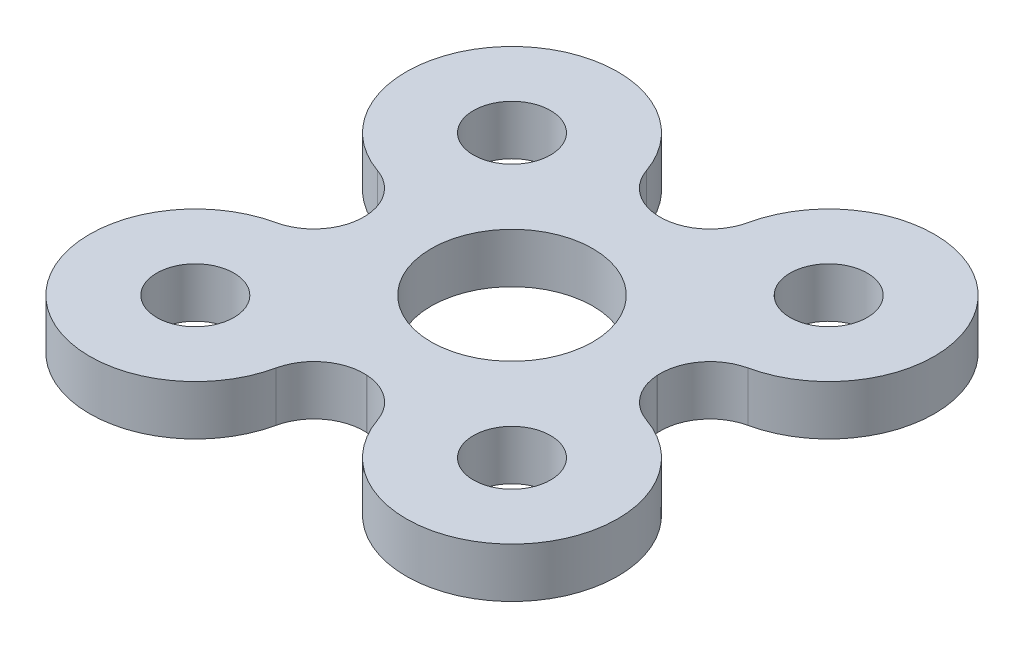
ISO-10303-21;
HEADER;
FILE_DESCRIPTION(('STEP AP214'),'2;1');
FILE_NAME('part.step','',(''),(''),'','','');
FILE_SCHEMA(('AUTOMOTIVE_DESIGN { 1 0 10303 214 1 1 1 1 }'));
ENDSEC;
DATA;
#1=APPLICATION_CONTEXT('core data for automotive mechanical design processes');
#2=APPLICATION_PROTOCOL_DEFINITION('international standard','automotive_design',2000,#1);
#3=PRODUCT_CONTEXT('',#1,'mechanical');
#4=PRODUCT('Part','Part','',(#3));
#5=PRODUCT_RELATED_PRODUCT_CATEGORY('part','',(#4));
#6=PRODUCT_DEFINITION_FORMATION('','',#4);
#7=PRODUCT_DEFINITION_CONTEXT('part definition',#1,'design');
#8=PRODUCT_DEFINITION('design','',#6,#7);
#9=PRODUCT_DEFINITION_SHAPE('','',#8);
#10=(LENGTH_UNIT() NAMED_UNIT(*) SI_UNIT(.MILLI.,.METRE.));
#11=(NAMED_UNIT(*) PLANE_ANGLE_UNIT() SI_UNIT($,.RADIAN.));
#12=(NAMED_UNIT(*) SI_UNIT($,.STERADIAN.) SOLID_ANGLE_UNIT());
#13=UNCERTAINTY_MEASURE_WITH_UNIT(LENGTH_MEASURE(1.E-05),#10,'distance_accuracy_value','');
#14=(GEOMETRIC_REPRESENTATION_CONTEXT(3) GLOBAL_UNCERTAINTY_ASSIGNED_CONTEXT((#13)) GLOBAL_UNIT_ASSIGNED_CONTEXT((#10,
#11,#12)) REPRESENTATION_CONTEXT('',''));
#15=CARTESIAN_POINT('',(0.,0.,0.));
#16=DIRECTION('',(0.,0.,1.));
#17=DIRECTION('',(1.,0.,0.));
#18=AXIS2_PLACEMENT_3D('',#15,#16,#17);
#19=CARTESIAN_POINT('',(-0.339490821660947,-2.,9.19373406087037));
#20=DIRECTION('',(0.,1.,0.));
#21=DIRECTION('',(0.,0.,1.));
#22=AXIS2_PLACEMENT_3D('',#19,#20,#21);
#23=CYLINDRICAL_SURFACE('',#22,3.5);
#24=CARTESIAN_POINT('',(-0.339490821660947,-2.,9.19373406087037));
#25=DIRECTION('',(0.,1.,0.));
#26=DIRECTION('',(0.,0.,1.));
#27=AXIS2_PLACEMENT_3D('',#24,#25,#26);
#28=CIRCLE('',#27,3.5);
#29=CARTESIAN_POINT('',(-0.133058471389949,-2.,5.69982712382102));
#30=VERTEX_POINT('',#29);
#31=CARTESIAN_POINT('',(-0.148470708568788,-2.,5.69895061745156));
#32=VERTEX_POINT('',#31);
#33=EDGE_CURVE('E323',#30,#32,#28,.T.);
#34=ORIENTED_EDGE('',*,*,#33,.F.);
#35=DIRECTION('',(0.,1.,0.));
#36=VECTOR('',#35,1.);
#37=CARTESIAN_POINT('',(-0.133058471389949,-2.,5.69982712382102));
#38=LINE('',#37,#36);
#39=CARTESIAN_POINT('',(-0.133058471389949,0.,5.69982712382102));
#40=VERTEX_POINT('',#39);
#41=EDGE_CURVE('E219',#30,#40,#38,.T.);
#42=ORIENTED_EDGE('',*,*,#41,.T.);
#43=CARTESIAN_POINT('',(-0.339490821660947,0.,9.19373406087037));
#44=DIRECTION('',(0.,1.,0.));
#45=DIRECTION('',(0.,0.,1.));
#46=AXIS2_PLACEMENT_3D('',#43,#44,#45);
#47=CIRCLE('',#46,3.5);
#48=CARTESIAN_POINT('',(-0.148470708568788,0.,5.69895061745156));
#49=VERTEX_POINT('',#48);
#50=EDGE_CURVE('E298',#40,#49,#47,.T.);
#51=ORIENTED_EDGE('',*,*,#50,.T.);
#52=DIRECTION('',(0.,1.,0.));
#53=VECTOR('',#52,1.);
#54=CARTESIAN_POINT('',(-0.148470708568788,-2.,5.69895061745156));
#55=LINE('',#54,#53);
#56=EDGE_CURVE('E217',#49,#32,#55,.F.);
#57=ORIENTED_EDGE('',*,*,#56,.T.);
#58=EDGE_LOOP('',(#34,#42,#51,#57));
#59=FACE_BOUND('',#58,.T.);
#60=ADVANCED_FACE('F47',(#59),#23,.F.);
#61=CARTESIAN_POINT('',(-6.36405673126666,-2.,6.36405673126669));
#62=DIRECTION('',(0.,1.,0.));
#63=DIRECTION('',(0.,0.,1.));
#64=AXIS2_PLACEMENT_3D('',#61,#62,#63);
#65=CYLINDRICAL_SURFACE('',#64,4.25);
#66=CARTESIAN_POINT('',(-6.36405673126666,-2.,6.36405673126669));
#67=DIRECTION('',(0.,1.,0.));
#68=DIRECTION('',(0.,0.,1.));
#69=AXIS2_PLACEMENT_3D('',#66,#67,#68);
#70=CIRCLE('',#69,4.25);
#71=CARTESIAN_POINT('',(-7.27394914846286,-2.,2.21259966306415));
#72=VERTEX_POINT('',#71);
#73=CARTESIAN_POINT('',(-2.2116831940622,-2.,7.26975756902942));
#74=VERTEX_POINT('',#73);
#75=EDGE_CURVE('E278',#72,#74,#70,.T.);
#76=ORIENTED_EDGE('',*,*,#75,.T.);
#77=DIRECTION('',(0.,1.,0.));
#78=VECTOR('',#77,1.);
#79=CARTESIAN_POINT('',(-2.2116831940622,-2.,7.26975756902942));
#80=LINE('',#79,#78);
#81=CARTESIAN_POINT('',(-2.2116831940622,0.,7.26975756902942));
#82=VERTEX_POINT('',#81);
#83=EDGE_CURVE('E224',#74,#82,#80,.T.);
#84=ORIENTED_EDGE('',*,*,#83,.T.);
#85=CARTESIAN_POINT('',(-6.36405673126666,0.,6.36405673126669));
#86=DIRECTION('',(0.,1.,0.));
#87=DIRECTION('',(0.,0.,1.));
#88=AXIS2_PLACEMENT_3D('',#85,#86,#87);
#89=CIRCLE('',#88,4.25);
#90=CARTESIAN_POINT('',(-7.27394914846286,0.,2.21259966306415));
#91=VERTEX_POINT('',#90);
#92=EDGE_CURVE('E262',#91,#82,#89,.T.);
#93=ORIENTED_EDGE('',*,*,#92,.F.);
#94=DIRECTION('',(0.,1.,0.));
#95=VECTOR('',#94,1.);
#96=CARTESIAN_POINT('',(-7.27394914846286,-2.,2.21259966306415));
#97=LINE('',#96,#95);
#98=EDGE_CURVE('E222',#91,#72,#97,.F.);
#99=ORIENTED_EDGE('',*,*,#98,.T.);
#100=EDGE_LOOP('',(#76,#84,#93,#99));
#101=FACE_BOUND('',#100,.T.);
#102=ADVANCED_FACE('F358',(#101),#65,.T.);
#103=CARTESIAN_POINT('',(-9.2,-2.,0.338953386132517));
#104=DIRECTION('',(0.,1.,0.));
#105=DIRECTION('',(0.,0.,1.));
#106=AXIS2_PLACEMENT_3D('',#103,#104,#105);
#107=CYLINDRICAL_SURFACE('',#106,3.5);
#108=CARTESIAN_POINT('',(-9.2,-2.,0.338953386132517));
#109=DIRECTION('',(0.,1.,0.));
#110=DIRECTION('',(0.,0.,1.));
#111=AXIS2_PLACEMENT_3D('',#108,#109,#110);
#112=CIRCLE('',#111,3.5);
#113=CARTESIAN_POINT('',(-5.7063245958294,-2.,0.128638930392015));
#114=VERTEX_POINT('',#113);
#115=CARTESIAN_POINT('',(-5.70497890255034,-2.,0.152332035848622));
#116=VERTEX_POINT('',#115);
#117=EDGE_CURVE('E272',#114,#116,#112,.F.);
#118=ORIENTED_EDGE('',*,*,#117,.T.);
#119=DIRECTION('',(0.,1.,0.));
#120=VECTOR('',#119,1.);
#121=CARTESIAN_POINT('',(-5.70497890255034,-2.,0.152332035848622));
#122=LINE('',#121,#120);
#123=CARTESIAN_POINT('',(-5.70497890255034,0.,0.152332035848622));
#124=VERTEX_POINT('',#123);
#125=EDGE_CURVE('E228',#116,#124,#122,.T.);
#126=ORIENTED_EDGE('',*,*,#125,.T.);
#127=CARTESIAN_POINT('',(-9.2,0.,0.338953386132517));
#128=DIRECTION('',(0.,1.,0.));
#129=DIRECTION('',(0.,0.,1.));
#130=AXIS2_PLACEMENT_3D('',#127,#128,#129);
#131=CIRCLE('',#130,3.5);
#132=CARTESIAN_POINT('',(-5.7063245958294,0.,0.128638930392015));
#133=VERTEX_POINT('',#132);
#134=EDGE_CURVE('E255',#133,#124,#131,.F.);
#135=ORIENTED_EDGE('',*,*,#134,.F.);
#136=DIRECTION('',(0.,1.,0.));
#137=VECTOR('',#136,1.);
#138=CARTESIAN_POINT('',(-5.7063245958294,-2.,0.128638930392015));
#139=LINE('',#138,#137);
#140=EDGE_CURVE('E69',#133,#114,#139,.F.);
#141=ORIENTED_EDGE('',*,*,#140,.T.);
#142=EDGE_LOOP('',(#118,#126,#135,#141));
#143=FACE_BOUND('',#142,.T.);
#144=ADVANCED_FACE('F260',(#143),#107,.F.);
#145=CARTESIAN_POINT('',(-5.65685424949237,-2.,-5.65685424949239));
#146=DIRECTION('',(0.,1.,0.));
#147=DIRECTION('',(0.,0.,1.));
#148=AXIS2_PLACEMENT_3D('',#145,#146,#147);
#149=CYLINDRICAL_SURFACE('',#148,4.25);
#150=CARTESIAN_POINT('',(-5.65685424949237,0.,-5.65685424949239));
#151=DIRECTION('',(0.,1.,0.));
#152=DIRECTION('',(0.,0.,1.));
#153=AXIS2_PLACEMENT_3D('',#150,#151,#152);
#154=CIRCLE('',#153,4.25);
#155=CARTESIAN_POINT('',(-1.63949988604424,0.,-7.04370821386075));
#156=VERTEX_POINT('',#155);
#157=CARTESIAN_POINT('',(-7.04803652776499,0.,-1.64099669865469));
#158=VERTEX_POINT('',#157);
#159=EDGE_CURVE('E257',#156,#158,#154,.T.);
#160=ORIENTED_EDGE('',*,*,#159,.F.);
#161=DIRECTION('',(0.,1.,0.));
#162=VECTOR('',#161,1.);
#163=CARTESIAN_POINT('',(-1.63949988604424,-2.,-7.04370821386075));
#164=LINE('',#163,#162);
#165=CARTESIAN_POINT('',(-1.63949988604424,-2.,-7.04370821386075));
#166=VERTEX_POINT('',#165);
#167=EDGE_CURVE('E206',#156,#166,#164,.F.);
#168=ORIENTED_EDGE('',*,*,#167,.T.);
#169=CARTESIAN_POINT('',(-5.65685424949237,-2.,-5.65685424949239));
#170=DIRECTION('',(0.,1.,0.));
#171=DIRECTION('',(0.,0.,1.));
#172=AXIS2_PLACEMENT_3D('',#169,#170,#171);
#173=CIRCLE('',#172,4.25);
#174=CARTESIAN_POINT('',(-7.04803652776499,-2.,-1.64099669865469));
#175=VERTEX_POINT('',#174);
#176=EDGE_CURVE('E270',#166,#175,#173,.T.);
#177=ORIENTED_EDGE('',*,*,#176,.T.);
#178=DIRECTION('',(0.,1.,0.));
#179=VECTOR('',#178,1.);
#180=CARTESIAN_POINT('',(-7.04803652776499,-2.,-1.64099669865468));
#181=LINE('',#180,#179);
#182=EDGE_CURVE('E203',#175,#158,#181,.T.);
#183=ORIENTED_EDGE('',*,*,#182,.T.);
#184=EDGE_LOOP('',(#160,#168,#177,#183));
#185=FACE_BOUND('',#184,.T.);
#186=ADVANCED_FACE('F274',(#185),#149,.T.);
#187=CARTESIAN_POINT('',(0.339490821660946,-2.,-9.19373406087037));
#188=DIRECTION('',(0.,1.,0.));
#189=DIRECTION('',(0.,0.,1.));
#190=AXIS2_PLACEMENT_3D('',#187,#188,#189);
#191=CYLINDRICAL_SURFACE('',#190,3.5);
#192=CARTESIAN_POINT('',(0.339490821660946,0.,-9.19373406087037));
#193=DIRECTION('',(0.,1.,0.));
#194=DIRECTION('',(0.,0.,1.));
#195=AXIS2_PLACEMENT_3D('',#192,#193,#194);
#196=CIRCLE('',#195,3.5);
#197=CARTESIAN_POINT('',(0.133058471389942,0.,-5.69982712382102));
#198=VERTEX_POINT('',#197);
#199=CARTESIAN_POINT('',(0.148470708568785,0.,-5.69895061745156));
#200=VERTEX_POINT('',#199);
#201=EDGE_CURVE('E184',#198,#200,#196,.T.);
#202=ORIENTED_EDGE('',*,*,#201,.T.);
#203=DIRECTION('',(0.,1.,0.));
#204=VECTOR('',#203,1.);
#205=CARTESIAN_POINT('',(0.148470708568785,-2.,-5.69895061745156));
#206=LINE('',#205,#204);
#207=CARTESIAN_POINT('',(0.148470708568785,-2.,-5.69895061745156));
#208=VERTEX_POINT('',#207);
#209=EDGE_CURVE('E201',#200,#208,#206,.F.);
#210=ORIENTED_EDGE('',*,*,#209,.T.);
#211=CARTESIAN_POINT('',(0.339490821660946,-2.,-9.19373406087037));
#212=DIRECTION('',(0.,1.,0.));
#213=DIRECTION('',(0.,0.,1.));
#214=AXIS2_PLACEMENT_3D('',#211,#212,#213);
#215=CIRCLE('',#214,3.5);
#216=CARTESIAN_POINT('',(0.133058471389942,-2.,-5.69982712382102));
#217=VERTEX_POINT('',#216);
#218=EDGE_CURVE('E276',#217,#208,#215,.T.);
#219=ORIENTED_EDGE('',*,*,#218,.F.);
#220=DIRECTION('',(0.,1.,0.));
#221=VECTOR('',#220,1.);
#222=CARTESIAN_POINT('',(0.133058471389942,-2.,-5.69982712382102));
#223=LINE('',#222,#221);
#224=EDGE_CURVE('E190',#217,#198,#223,.T.);
#225=ORIENTED_EDGE('',*,*,#224,.T.);
#226=EDGE_LOOP('',(#202,#210,#219,#225));
#227=FACE_BOUND('',#226,.T.);
#228=ADVANCED_FACE('F342',(#227),#191,.F.);
#229=CARTESIAN_POINT('',(6.36405673126666,-2.,-6.36405673126669));
#230=DIRECTION('',(0.,1.,0.));
#231=DIRECTION('',(0.,0.,1.));
#232=AXIS2_PLACEMENT_3D('',#229,#230,#231);
#233=CYLINDRICAL_SURFACE('',#232,4.25);
#234=CARTESIAN_POINT('',(6.36405673126666,-2.,-6.36405673126669));
#235=DIRECTION('',(0.,1.,0.));
#236=DIRECTION('',(0.,0.,1.));
#237=AXIS2_PLACEMENT_3D('',#234,#235,#236);
#238=CIRCLE('',#237,4.25);
#239=CARTESIAN_POINT('',(7.27394914846286,-2.,-2.21259966306414));
#240=VERTEX_POINT('',#239);
#241=CARTESIAN_POINT('',(2.2116831940622,-2.,-7.26975756902942));
#242=VERTEX_POINT('',#241);
#243=EDGE_CURVE('E281',#240,#242,#238,.T.);
#244=ORIENTED_EDGE('',*,*,#243,.T.);
#245=DIRECTION('',(0.,1.,0.));
#246=VECTOR('',#245,1.);
#247=CARTESIAN_POINT('',(2.2116831940622,-2.,-7.26975756902942));
#248=LINE('',#247,#246);
#249=CARTESIAN_POINT('',(2.2116831940622,0.,-7.26975756902942));
#250=VERTEX_POINT('',#249);
#251=EDGE_CURVE('E183',#242,#250,#248,.T.);
#252=ORIENTED_EDGE('',*,*,#251,.T.);
#253=CARTESIAN_POINT('',(6.36405673126666,0.,-6.36405673126669));
#254=DIRECTION('',(0.,1.,0.));
#255=DIRECTION('',(0.,0.,1.));
#256=AXIS2_PLACEMENT_3D('',#253,#254,#255);
#257=CIRCLE('',#256,4.25);
#258=CARTESIAN_POINT('',(7.27394914846286,0.,-2.21259966306414));
#259=VERTEX_POINT('',#258);
#260=EDGE_CURVE('E166',#259,#250,#257,.T.);
#261=ORIENTED_EDGE('',*,*,#260,.F.);
#262=DIRECTION('',(0.,1.,0.));
#263=VECTOR('',#262,1.);
#264=CARTESIAN_POINT('',(7.27394914846286,-2.,-2.21259966306414));
#265=LINE('',#264,#263);
#266=EDGE_CURVE('E180',#259,#240,#265,.F.);
#267=ORIENTED_EDGE('',*,*,#266,.T.);
#268=EDGE_LOOP('',(#244,#252,#261,#267));
#269=FACE_BOUND('',#268,.T.);
#270=ADVANCED_FACE('F179',(#269),#233,.T.);
#271=CARTESIAN_POINT('',(9.2,-2.,-0.338953386132518));
#272=DIRECTION('',(0.,1.,0.));
#273=DIRECTION('',(0.,0.,1.));
#274=AXIS2_PLACEMENT_3D('',#271,#272,#273);
#275=CYLINDRICAL_SURFACE('',#274,3.5);
#276=CARTESIAN_POINT('',(9.2,0.,-0.338953386132518));
#277=DIRECTION('',(0.,1.,0.));
#278=DIRECTION('',(0.,0.,1.));
#279=AXIS2_PLACEMENT_3D('',#276,#277,#278);
#280=CIRCLE('',#279,3.5);
#281=CARTESIAN_POINT('',(5.70497890255034,0.,-0.152332035848613));
#282=VERTEX_POINT('',#281);
#283=CARTESIAN_POINT('',(5.7063245958294,0.,-0.128638930392021));
#284=VERTEX_POINT('',#283);
#285=EDGE_CURVE('E168',#282,#284,#280,.T.);
#286=ORIENTED_EDGE('',*,*,#285,.T.);
#287=DIRECTION('',(0.,1.,0.));
#288=VECTOR('',#287,1.);
#289=CARTESIAN_POINT('',(5.7063245958294,-2.,-0.128638930392021));
#290=LINE('',#289,#288);
#291=CARTESIAN_POINT('',(5.7063245958294,-2.,-0.128638930392021));
#292=VERTEX_POINT('',#291);
#293=EDGE_CURVE('E215',#284,#292,#290,.F.);
#294=ORIENTED_EDGE('',*,*,#293,.T.);
#295=CARTESIAN_POINT('',(9.2,-2.,-0.338953386132518));
#296=DIRECTION('',(0.,1.,0.));
#297=DIRECTION('',(0.,0.,1.));
#298=AXIS2_PLACEMENT_3D('',#295,#296,#297);
#299=CIRCLE('',#298,3.5);
#300=CARTESIAN_POINT('',(5.70497890255034,-2.,-0.152332035848613));
#301=VERTEX_POINT('',#300);
#302=EDGE_CURVE('E332',#301,#292,#299,.T.);
#303=ORIENTED_EDGE('',*,*,#302,.F.);
#304=DIRECTION('',(0.,1.,0.));
#305=VECTOR('',#304,1.);
#306=CARTESIAN_POINT('',(5.70497890255034,-2.,-0.152332035848613));
#307=LINE('',#306,#305);
#308=EDGE_CURVE('E213',#301,#282,#307,.T.);
#309=ORIENTED_EDGE('',*,*,#308,.T.);
#310=EDGE_LOOP('',(#286,#294,#303,#309));
#311=FACE_BOUND('',#310,.T.);
#312=ADVANCED_FACE('F374',(#311),#275,.F.);
#313=CARTESIAN_POINT('',(6.36405673126666,-2.,-6.36405673126669));
#314=DIRECTION('',(0.,1.,0.));
#315=DIRECTION('',(0.,0.,1.));
#316=AXIS2_PLACEMENT_3D('',#313,#314,#315);
#317=CYLINDRICAL_SURFACE('',#316,1.55);
#318=CARTESIAN_POINT('',(6.36405673126666,-2.,-6.36405673126669));
#319=DIRECTION('',(0.,1.,0.));
#320=DIRECTION('',(0.,0.,1.));
#321=AXIS2_PLACEMENT_3D('',#318,#319,#320);
#322=CIRCLE('',#321,1.55);
#323=CARTESIAN_POINT('',(6.36405673126666,-2.,-4.81405673126669));
#324=VERTEX_POINT('',#323);
#325=EDGE_CURVE('E193',#324,#324,#322,.T.);
#326=ORIENTED_EDGE('',*,*,#325,.F.);
#327=EDGE_LOOP('',(#326));
#328=FACE_BOUND('',#327,.T.);
#329=CARTESIAN_POINT('',(6.36405673126666,0.,-6.36405673126669));
#330=DIRECTION('',(0.,1.,0.));
#331=DIRECTION('',(0.,0.,1.));
#332=AXIS2_PLACEMENT_3D('',#329,#330,#331);
#333=CIRCLE('',#332,1.55);
#334=CARTESIAN_POINT('',(6.36405673126666,0.,-4.81405673126669));
#335=VERTEX_POINT('',#334);
#336=EDGE_CURVE('E318',#335,#335,#333,.T.);
#337=ORIENTED_EDGE('',*,*,#336,.T.);
#338=EDGE_LOOP('',(#337));
#339=FACE_BOUND('',#338,.T.);
#340=ADVANCED_FACE('F377',(#328,#339),#317,.F.);
#341=CARTESIAN_POINT('',(5.65685424949237,-2.,5.65685424949239));
#342=DIRECTION('',(0.,1.,0.));
#343=DIRECTION('',(0.,0.,1.));
#344=AXIS2_PLACEMENT_3D('',#341,#342,#343);
#345=CYLINDRICAL_SURFACE('',#344,1.55);
#346=CARTESIAN_POINT('',(5.65685424949237,-2.,5.65685424949239));
#347=DIRECTION('',(0.,1.,0.));
#348=DIRECTION('',(0.,0.,1.));
#349=AXIS2_PLACEMENT_3D('',#346,#347,#348);
#350=CIRCLE('',#349,1.55);
#351=CARTESIAN_POINT('',(5.65685424949237,-2.,7.20685424949239));
#352=VERTEX_POINT('',#351);
#353=EDGE_CURVE('E293',#352,#352,#350,.T.);
#354=ORIENTED_EDGE('',*,*,#353,.F.);
#355=EDGE_LOOP('',(#354));
#356=FACE_BOUND('',#355,.T.);
#357=CARTESIAN_POINT('',(5.65685424949237,0.,5.65685424949239));
#358=DIRECTION('',(0.,1.,0.));
#359=DIRECTION('',(0.,0.,1.));
#360=AXIS2_PLACEMENT_3D('',#357,#358,#359);
#361=CIRCLE('',#360,1.55);
#362=CARTESIAN_POINT('',(5.65685424949237,0.,7.20685424949239));
#363=VERTEX_POINT('',#362);
#364=EDGE_CURVE('E316',#363,#363,#361,.T.);
#365=ORIENTED_EDGE('',*,*,#364,.T.);
#366=EDGE_LOOP('',(#365));
#367=FACE_BOUND('',#366,.T.);
#368=ADVANCED_FACE('F393',(#356,#367),#345,.F.);
#369=CARTESIAN_POINT('',(-5.65685424949237,-2.,-5.65685424949239));
#370=DIRECTION('',(0.,1.,0.));
#371=DIRECTION('',(0.,0.,1.));
#372=AXIS2_PLACEMENT_3D('',#369,#370,#371);
#373=CYLINDRICAL_SURFACE('',#372,1.55);
#374=CARTESIAN_POINT('',(-5.65685424949237,-2.,-5.65685424949239));
#375=DIRECTION('',(0.,1.,0.));
#376=DIRECTION('',(0.,0.,1.));
#377=AXIS2_PLACEMENT_3D('',#374,#375,#376);
#378=CIRCLE('',#377,1.55);
#379=CARTESIAN_POINT('',(-5.65685424949237,-2.,-4.10685424949239));
#380=VERTEX_POINT('',#379);
#381=EDGE_CURVE('E290',#380,#380,#378,.T.);
#382=ORIENTED_EDGE('',*,*,#381,.F.);
#383=EDGE_LOOP('',(#382));
#384=FACE_BOUND('',#383,.T.);
#385=CARTESIAN_POINT('',(-5.65685424949237,0.,-5.65685424949239));
#386=DIRECTION('',(0.,1.,0.));
#387=DIRECTION('',(0.,0.,1.));
#388=AXIS2_PLACEMENT_3D('',#385,#386,#387);
#389=CIRCLE('',#388,1.55);
#390=CARTESIAN_POINT('',(-5.65685424949237,0.,-4.10685424949239));
#391=VERTEX_POINT('',#390);
#392=EDGE_CURVE('E313',#391,#391,#389,.T.);
#393=ORIENTED_EDGE('',*,*,#392,.T.);
#394=EDGE_LOOP('',(#393));
#395=FACE_BOUND('',#394,.T.);
#396=ADVANCED_FACE('F389',(#384,#395),#373,.F.);
#397=CARTESIAN_POINT('',(0.,-2.,0.));
#398=DIRECTION('',(0.,1.,0.));
#399=DIRECTION('',(0.,0.,1.));
#400=AXIS2_PLACEMENT_3D('',#397,#398,#399);
#401=CYLINDRICAL_SURFACE('',#400,3.25);
#402=CARTESIAN_POINT('',(0.,-2.,0.));
#403=DIRECTION('',(0.,1.,0.));
#404=DIRECTION('',(0.,0.,1.));
#405=AXIS2_PLACEMENT_3D('',#402,#403,#404);
#406=CIRCLE('',#405,3.25);
#407=CARTESIAN_POINT('',(0.,-2.,3.25));
#408=VERTEX_POINT('',#407);
#409=EDGE_CURVE('E287',#408,#408,#406,.T.);
#410=ORIENTED_EDGE('',*,*,#409,.F.);
#411=EDGE_LOOP('',(#410));
#412=FACE_BOUND('',#411,.T.);
#413=CARTESIAN_POINT('',(0.,0.,0.));
#414=DIRECTION('',(0.,1.,0.));
#415=DIRECTION('',(0.,0.,1.));
#416=AXIS2_PLACEMENT_3D('',#413,#414,#415);
#417=CIRCLE('',#416,3.25);
#418=CARTESIAN_POINT('',(0.,0.,3.25));
#419=VERTEX_POINT('',#418);
#420=EDGE_CURVE('E310',#419,#419,#417,.T.);
#421=ORIENTED_EDGE('',*,*,#420,.T.);
#422=EDGE_LOOP('',(#421));
#423=FACE_BOUND('',#422,.T.);
#424=ADVANCED_FACE('F372',(#412,#423),#401,.F.);
#425=CARTESIAN_POINT('',(5.65685424949237,-2.,5.65685424949239));
#426=DIRECTION('',(0.,1.,0.));
#427=DIRECTION('',(0.,0.,1.));
#428=AXIS2_PLACEMENT_3D('',#425,#426,#427);
#429=CYLINDRICAL_SURFACE('',#428,4.25);
#430=CARTESIAN_POINT('',(5.65685424949237,-2.,5.65685424949239));
#431=DIRECTION('',(0.,1.,0.));
#432=DIRECTION('',(0.,0.,1.));
#433=AXIS2_PLACEMENT_3D('',#430,#431,#432);
#434=CIRCLE('',#433,4.25);
#435=CARTESIAN_POINT('',(1.63949988604423,-2.,7.04370821386075));
#436=VERTEX_POINT('',#435);
#437=CARTESIAN_POINT('',(7.04803652776498,-2.,1.64099669865468));
#438=VERTEX_POINT('',#437);
#439=EDGE_CURVE('E327',#436,#438,#434,.T.);
#440=ORIENTED_EDGE('',*,*,#439,.T.);
#441=DIRECTION('',(0.,1.,0.));
#442=VECTOR('',#441,1.);
#443=CARTESIAN_POINT('',(7.04803652776498,-2.,1.64099669865468));
#444=LINE('',#443,#442);
#445=CARTESIAN_POINT('',(7.04803652776498,0.,1.64099669865468));
#446=VERTEX_POINT('',#445);
#447=EDGE_CURVE('E210',#438,#446,#444,.T.);
#448=ORIENTED_EDGE('',*,*,#447,.T.);
#449=CARTESIAN_POINT('',(5.65685424949237,0.,5.65685424949239));
#450=DIRECTION('',(0.,1.,0.));
#451=DIRECTION('',(0.,0.,1.));
#452=AXIS2_PLACEMENT_3D('',#449,#450,#451);
#453=CIRCLE('',#452,4.25);
#454=CARTESIAN_POINT('',(1.63949988604423,0.,7.04370821386075));
#455=VERTEX_POINT('',#454);
#456=EDGE_CURVE('E301',#455,#446,#453,.T.);
#457=ORIENTED_EDGE('',*,*,#456,.F.);
#458=DIRECTION('',(0.,1.,0.));
#459=VECTOR('',#458,1.);
#460=CARTESIAN_POINT('',(1.63949988604423,-2.,7.04370821386075));
#461=LINE('',#460,#459);
#462=EDGE_CURVE('E208',#455,#436,#461,.F.);
#463=ORIENTED_EDGE('',*,*,#462,.T.);
#464=EDGE_LOOP('',(#440,#448,#457,#463));
#465=FACE_BOUND('',#464,.T.);
#466=ADVANCED_FACE('F368',(#465),#429,.T.);
#467=CARTESIAN_POINT('',(-6.36405673126666,-2.,6.36405673126669));
#468=DIRECTION('',(0.,1.,0.));
#469=DIRECTION('',(0.,0.,1.));
#470=AXIS2_PLACEMENT_3D('',#467,#468,#469);
#471=CYLINDRICAL_SURFACE('',#470,1.55);
#472=CARTESIAN_POINT('',(-6.36405673126666,-2.,6.36405673126669));
#473=DIRECTION('',(0.,1.,0.));
#474=DIRECTION('',(0.,0.,1.));
#475=AXIS2_PLACEMENT_3D('',#472,#473,#474);
#476=CIRCLE('',#475,1.55);
#477=CARTESIAN_POINT('',(-6.36405673126666,-2.,7.91405673126669));
#478=VERTEX_POINT('',#477);
#479=EDGE_CURVE('E188',#478,#478,#476,.T.);
#480=ORIENTED_EDGE('',*,*,#479,.F.);
#481=EDGE_LOOP('',(#480));
#482=FACE_BOUND('',#481,.T.);
#483=CARTESIAN_POINT('',(-6.36405673126666,0.,6.36405673126669));
#484=DIRECTION('',(0.,1.,0.));
#485=DIRECTION('',(0.,0.,1.));
#486=AXIS2_PLACEMENT_3D('',#483,#484,#485);
#487=CIRCLE('',#486,1.55);
#488=CARTESIAN_POINT('',(-6.36405673126666,0.,7.91405673126669));
#489=VERTEX_POINT('',#488);
#490=EDGE_CURVE('E196',#489,#489,#487,.T.);
#491=ORIENTED_EDGE('',*,*,#490,.T.);
#492=EDGE_LOOP('',(#491));
#493=FACE_BOUND('',#492,.T.);
#494=ADVANCED_FACE('F371',(#482,#493),#471,.F.);
#495=CARTESIAN_POINT('',(0.,-2.,0.));
#496=DIRECTION('',(0.,1.,0.));
#497=DIRECTION('',(0.,0.,1.));
#498=AXIS2_PLACEMENT_3D('',#495,#496,#497);
#499=PLANE('',#498);
#500=ORIENTED_EDGE('',*,*,#439,.F.);
#501=CARTESIAN_POINT('',(-0.251019814401948,-2.,7.6963453735635));
#502=DIRECTION('',(0.,1.,0.));
#503=DIRECTION('',(0.,0.,1.));
#504=AXIS2_PLACEMENT_3D('',#501,#502,#503);
#505=CIRCLE('',#504,2.);
#506=EDGE_CURVE('E245',#436,#30,#505,.T.);
#507=ORIENTED_EDGE('',*,*,#506,.T.);
#508=ORIENTED_EDGE('',*,*,#33,.T.);
#509=CARTESIAN_POINT('',(-0.257625058907164,-2.,7.69596972797659));
#510=DIRECTION('',(0.,1.,0.));
#511=DIRECTION('',(0.,0.,1.));
#512=AXIS2_PLACEMENT_3D('',#509,#510,#511);
#513=CIRCLE('',#512,2.);
#514=EDGE_CURVE('E249',#32,#74,#513,.T.);
#515=ORIENTED_EDGE('',*,*,#514,.T.);
#516=ORIENTED_EDGE('',*,*,#75,.F.);
#517=CARTESIAN_POINT('',(-7.70213381537872,-2.,0.258972807439419));
#518=DIRECTION('',(0.,1.,0.));
#519=DIRECTION('',(0.,0.,1.));
#520=AXIS2_PLACEMENT_3D('',#517,#518,#519);
#521=CIRCLE('',#520,2.);
#522=EDGE_CURVE('E62',#72,#116,#521,.T.);
#523=ORIENTED_EDGE('',*,*,#522,.T.);
#524=ORIENTED_EDGE('',*,*,#117,.F.);
#525=CARTESIAN_POINT('',(-7.70271054106975,-2.,0.248818619386588));
#526=DIRECTION('',(0.,1.,0.));
#527=DIRECTION('',(0.,0.,1.));
#528=AXIS2_PLACEMENT_3D('',#525,#526,#527);
#529=CIRCLE('',#528,2.);
#530=EDGE_CURVE('E11',#114,#175,#529,.T.);
#531=ORIENTED_EDGE('',*,*,#530,.T.);
#532=ORIENTED_EDGE('',*,*,#176,.F.);
#533=CARTESIAN_POINT('',(0.251019814401944,-2.,-7.69634537356351));
#534=DIRECTION('',(0.,1.,0.));
#535=DIRECTION('',(0.,0.,1.));
#536=AXIS2_PLACEMENT_3D('',#533,#534,#535);
#537=CIRCLE('',#536,2.);
#538=EDGE_CURVE('E237',#166,#217,#537,.T.);
#539=ORIENTED_EDGE('',*,*,#538,.T.);
#540=ORIENTED_EDGE('',*,*,#218,.T.);
#541=CARTESIAN_POINT('',(0.257625058907162,-2.,-7.69596972797659));
#542=DIRECTION('',(0.,1.,0.));
#543=DIRECTION('',(0.,0.,1.));
#544=AXIS2_PLACEMENT_3D('',#541,#542,#543);
#545=CIRCLE('',#544,2.);
#546=EDGE_CURVE('E233',#208,#242,#545,.T.);
#547=ORIENTED_EDGE('',*,*,#546,.T.);
#548=ORIENTED_EDGE('',*,*,#243,.F.);
#549=CARTESIAN_POINT('',(7.70213381537872,-2.,-0.258972807439416));
#550=DIRECTION('',(0.,1.,0.));
#551=DIRECTION('',(0.,0.,1.));
#552=AXIS2_PLACEMENT_3D('',#549,#550,#551);
#553=CIRCLE('',#552,2.);
#554=EDGE_CURVE('E173',#240,#301,#553,.T.);
#555=ORIENTED_EDGE('',*,*,#554,.T.);
#556=ORIENTED_EDGE('',*,*,#302,.T.);
#557=CARTESIAN_POINT('',(7.70271054106974,-2.,-0.248818619386591));
#558=DIRECTION('',(0.,1.,0.));
#559=DIRECTION('',(0.,0.,1.));
#560=AXIS2_PLACEMENT_3D('',#557,#558,#559);
#561=CIRCLE('',#560,2.);
#562=EDGE_CURVE('E174',#292,#438,#561,.T.);
#563=ORIENTED_EDGE('',*,*,#562,.T.);
#564=EDGE_LOOP('',(#500,#507,#508,#515,#516,#523,#524,#531,#532,#539,#540,#547,#548,#555,#556,#563));
#565=FACE_BOUND('',#564,.T.);
#566=ORIENTED_EDGE('',*,*,#409,.T.);
#567=EDGE_LOOP('',(#566));
#568=FACE_BOUND('',#567,.T.);
#569=ORIENTED_EDGE('',*,*,#381,.T.);
#570=EDGE_LOOP('',(#569));
#571=FACE_BOUND('',#570,.T.);
#572=ORIENTED_EDGE('',*,*,#353,.T.);
#573=EDGE_LOOP('',(#572));
#574=FACE_BOUND('',#573,.T.);
#575=ORIENTED_EDGE('',*,*,#325,.T.);
#576=EDGE_LOOP('',(#575));
#577=FACE_BOUND('',#576,.T.);
#578=ORIENTED_EDGE('',*,*,#479,.T.);
#579=EDGE_LOOP('',(#578));
#580=FACE_BOUND('',#579,.T.);
#581=ADVANCED_FACE('F268',(#565,#568,#571,#574,#577,#580),#499,.F.);
#582=CARTESIAN_POINT('',(0.,0.,0.));
#583=DIRECTION('',(0.,1.,0.));
#584=DIRECTION('',(0.,0.,1.));
#585=AXIS2_PLACEMENT_3D('',#582,#583,#584);
#586=PLANE('',#585);
#587=ORIENTED_EDGE('',*,*,#50,.F.);
#588=CARTESIAN_POINT('',(-0.251019814401948,0.,7.6963453735635));
#589=DIRECTION('',(0.,1.,0.));
#590=DIRECTION('',(0.,0.,1.));
#591=AXIS2_PLACEMENT_3D('',#588,#589,#590);
#592=CIRCLE('',#591,2.);
#593=EDGE_CURVE('E243',#40,#455,#592,.F.);
#594=ORIENTED_EDGE('',*,*,#593,.T.);
#595=ORIENTED_EDGE('',*,*,#456,.T.);
#596=CARTESIAN_POINT('',(7.70271054106974,0.,-0.248818619386591));
#597=DIRECTION('',(0.,1.,0.));
#598=DIRECTION('',(0.,0.,1.));
#599=AXIS2_PLACEMENT_3D('',#596,#597,#598);
#600=CIRCLE('',#599,2.);
#601=EDGE_CURVE('E239',#446,#284,#600,.F.);
#602=ORIENTED_EDGE('',*,*,#601,.T.);
#603=ORIENTED_EDGE('',*,*,#285,.F.);
#604=CARTESIAN_POINT('',(7.70213381537872,0.,-0.258972807439416));
#605=DIRECTION('',(0.,1.,0.));
#606=DIRECTION('',(0.,0.,1.));
#607=AXIS2_PLACEMENT_3D('',#604,#605,#606);
#608=CIRCLE('',#607,2.);
#609=EDGE_CURVE('E161',#282,#259,#608,.F.);
#610=ORIENTED_EDGE('',*,*,#609,.T.);
#611=ORIENTED_EDGE('',*,*,#260,.T.);
#612=CARTESIAN_POINT('',(0.257625058907162,0.,-7.69596972797659));
#613=DIRECTION('',(0.,1.,0.));
#614=DIRECTION('',(0.,0.,1.));
#615=AXIS2_PLACEMENT_3D('',#612,#613,#614);
#616=CIRCLE('',#615,2.);
#617=EDGE_CURVE('E231',#250,#200,#616,.F.);
#618=ORIENTED_EDGE('',*,*,#617,.T.);
#619=ORIENTED_EDGE('',*,*,#201,.F.);
#620=CARTESIAN_POINT('',(0.251019814401944,0.,-7.69634537356351));
#621=DIRECTION('',(0.,1.,0.));
#622=DIRECTION('',(0.,0.,1.));
#623=AXIS2_PLACEMENT_3D('',#620,#621,#622);
#624=CIRCLE('',#623,2.);
#625=EDGE_CURVE('E235',#198,#156,#624,.F.);
#626=ORIENTED_EDGE('',*,*,#625,.T.);
#627=ORIENTED_EDGE('',*,*,#159,.T.);
#628=CARTESIAN_POINT('',(-7.70271054106975,0.,0.248818619386588));
#629=DIRECTION('',(0.,1.,0.));
#630=DIRECTION('',(0.,0.,1.));
#631=AXIS2_PLACEMENT_3D('',#628,#629,#630);
#632=CIRCLE('',#631,2.);
#633=EDGE_CURVE('E55',#158,#133,#632,.F.);
#634=ORIENTED_EDGE('',*,*,#633,.T.);
#635=ORIENTED_EDGE('',*,*,#134,.T.);
#636=CARTESIAN_POINT('',(-7.70213381537872,0.,0.258972807439419));
#637=DIRECTION('',(0.,1.,0.));
#638=DIRECTION('',(0.,0.,1.));
#639=AXIS2_PLACEMENT_3D('',#636,#637,#638);
#640=CIRCLE('',#639,2.);
#641=EDGE_CURVE('E251',#124,#91,#640,.F.);
#642=ORIENTED_EDGE('',*,*,#641,.T.);
#643=ORIENTED_EDGE('',*,*,#92,.T.);
#644=CARTESIAN_POINT('',(-0.257625058907164,0.,7.69596972797659));
#645=DIRECTION('',(0.,1.,0.));
#646=DIRECTION('',(0.,0.,1.));
#647=AXIS2_PLACEMENT_3D('',#644,#645,#646);
#648=CIRCLE('',#647,2.);
#649=EDGE_CURVE('E247',#82,#49,#648,.F.);
#650=ORIENTED_EDGE('',*,*,#649,.T.);
#651=EDGE_LOOP('',(#587,#594,#595,#602,#603,#610,#611,#618,#619,#626,#627,#634,#635,#642,#643,#650));
#652=FACE_BOUND('',#651,.T.);
#653=ORIENTED_EDGE('',*,*,#420,.F.);
#654=EDGE_LOOP('',(#653));
#655=FACE_BOUND('',#654,.T.);
#656=ORIENTED_EDGE('',*,*,#392,.F.);
#657=EDGE_LOOP('',(#656));
#658=FACE_BOUND('',#657,.T.);
#659=ORIENTED_EDGE('',*,*,#364,.F.);
#660=EDGE_LOOP('',(#659));
#661=FACE_BOUND('',#660,.T.);
#662=ORIENTED_EDGE('',*,*,#336,.F.);
#663=EDGE_LOOP('',(#662));
#664=FACE_BOUND('',#663,.T.);
#665=ORIENTED_EDGE('',*,*,#490,.F.);
#666=EDGE_LOOP('',(#665));
#667=FACE_BOUND('',#666,.T.);
#668=ADVANCED_FACE('F164',(#652,#655,#658,#661,#664,#667),#586,.T.);
#669=CARTESIAN_POINT('',(0.257625058907162,-2.,-7.69596972797659));
#670=DIRECTION('',(0.,1.,0.));
#671=DIRECTION('',(0.,0.,1.));
#672=AXIS2_PLACEMENT_3D('',#669,#670,#671);
#673=CYLINDRICAL_SURFACE('',#672,2.);
#674=ORIENTED_EDGE('',*,*,#546,.F.);
#675=ORIENTED_EDGE('',*,*,#209,.F.);
#676=ORIENTED_EDGE('',*,*,#617,.F.);
#677=ORIENTED_EDGE('',*,*,#251,.F.);
#678=EDGE_LOOP('',(#674,#675,#676,#677));
#679=FACE_BOUND('',#678,.T.);
#680=ADVANCED_FACE('F338',(#679),#673,.F.);
#681=CARTESIAN_POINT('',(0.251019814401944,-2.,-7.69634537356351));
#682=DIRECTION('',(0.,1.,0.));
#683=DIRECTION('',(0.,0.,1.));
#684=AXIS2_PLACEMENT_3D('',#681,#682,#683);
#685=CYLINDRICAL_SURFACE('',#684,2.);
#686=ORIENTED_EDGE('',*,*,#538,.F.);
#687=ORIENTED_EDGE('',*,*,#167,.F.);
#688=ORIENTED_EDGE('',*,*,#625,.F.);
#689=ORIENTED_EDGE('',*,*,#224,.F.);
#690=EDGE_LOOP('',(#686,#687,#688,#689));
#691=FACE_BOUND('',#690,.T.);
#692=ADVANCED_FACE('F346',(#691),#685,.F.);
#693=CARTESIAN_POINT('',(7.70271054106974,-2.,-0.248818619386591));
#694=DIRECTION('',(0.,1.,0.));
#695=DIRECTION('',(0.,0.,1.));
#696=AXIS2_PLACEMENT_3D('',#693,#694,#695);
#697=CYLINDRICAL_SURFACE('',#696,2.);
#698=ORIENTED_EDGE('',*,*,#562,.F.);
#699=ORIENTED_EDGE('',*,*,#293,.F.);
#700=ORIENTED_EDGE('',*,*,#601,.F.);
#701=ORIENTED_EDGE('',*,*,#447,.F.);
#702=EDGE_LOOP('',(#698,#699,#700,#701));
#703=FACE_BOUND('',#702,.T.);
#704=ADVANCED_FACE('F348',(#703),#697,.F.);
#705=CARTESIAN_POINT('',(7.70213381537872,-2.,-0.258972807439416));
#706=DIRECTION('',(0.,1.,0.));
#707=DIRECTION('',(0.,0.,1.));
#708=AXIS2_PLACEMENT_3D('',#705,#706,#707);
#709=CYLINDRICAL_SURFACE('',#708,2.);
#710=ORIENTED_EDGE('',*,*,#554,.F.);
#711=ORIENTED_EDGE('',*,*,#266,.F.);
#712=ORIENTED_EDGE('',*,*,#609,.F.);
#713=ORIENTED_EDGE('',*,*,#308,.F.);
#714=EDGE_LOOP('',(#710,#711,#712,#713));
#715=FACE_BOUND('',#714,.T.);
#716=ADVANCED_FACE('F187',(#715),#709,.F.);
#717=CARTESIAN_POINT('',(-0.251019814401948,-2.,7.6963453735635));
#718=DIRECTION('',(0.,1.,0.));
#719=DIRECTION('',(0.,0.,1.));
#720=AXIS2_PLACEMENT_3D('',#717,#718,#719);
#721=CYLINDRICAL_SURFACE('',#720,2.);
#722=ORIENTED_EDGE('',*,*,#506,.F.);
#723=ORIENTED_EDGE('',*,*,#462,.F.);
#724=ORIENTED_EDGE('',*,*,#593,.F.);
#725=ORIENTED_EDGE('',*,*,#41,.F.);
#726=EDGE_LOOP('',(#722,#723,#724,#725));
#727=FACE_BOUND('',#726,.T.);
#728=ADVANCED_FACE('F441',(#727),#721,.F.);
#729=CARTESIAN_POINT('',(-0.257625058907164,-2.,7.69596972797659));
#730=DIRECTION('',(0.,1.,0.));
#731=DIRECTION('',(0.,0.,1.));
#732=AXIS2_PLACEMENT_3D('',#729,#730,#731);
#733=CYLINDRICAL_SURFACE('',#732,2.);
#734=ORIENTED_EDGE('',*,*,#514,.F.);
#735=ORIENTED_EDGE('',*,*,#56,.F.);
#736=ORIENTED_EDGE('',*,*,#649,.F.);
#737=ORIENTED_EDGE('',*,*,#83,.F.);
#738=EDGE_LOOP('',(#734,#735,#736,#737));
#739=FACE_BOUND('',#738,.T.);
#740=ADVANCED_FACE('F450',(#739),#733,.F.);
#741=CARTESIAN_POINT('',(-7.70213381537872,-2.,0.258972807439419));
#742=DIRECTION('',(0.,1.,0.));
#743=DIRECTION('',(0.,0.,1.));
#744=AXIS2_PLACEMENT_3D('',#741,#742,#743);
#745=CYLINDRICAL_SURFACE('',#744,2.);
#746=ORIENTED_EDGE('',*,*,#522,.F.);
#747=ORIENTED_EDGE('',*,*,#98,.F.);
#748=ORIENTED_EDGE('',*,*,#641,.F.);
#749=ORIENTED_EDGE('',*,*,#125,.F.);
#750=EDGE_LOOP('',(#746,#747,#748,#749));
#751=FACE_BOUND('',#750,.T.);
#752=ADVANCED_FACE('F460',(#751),#745,.F.);
#753=CARTESIAN_POINT('',(-7.70271054106975,-2.,0.248818619386588));
#754=DIRECTION('',(0.,1.,0.));
#755=DIRECTION('',(0.,0.,1.));
#756=AXIS2_PLACEMENT_3D('',#753,#754,#755);
#757=CYLINDRICAL_SURFACE('',#756,2.);
#758=ORIENTED_EDGE('',*,*,#530,.F.);
#759=ORIENTED_EDGE('',*,*,#140,.F.);
#760=ORIENTED_EDGE('',*,*,#633,.F.);
#761=ORIENTED_EDGE('',*,*,#182,.F.);
#762=EDGE_LOOP('',(#758,#759,#760,#761));
#763=FACE_BOUND('',#762,.T.);
#764=ADVANCED_FACE('F49',(#763),#757,.F.);
#765=CLOSED_SHELL('',(#60,#102,#144,#186,#228,#270,#312,#340,#368,#396,#424,#466,#494,#581,#668,
#680,#692,#704,#716,#728,#740,#752,#764));
#766=MANIFOLD_SOLID_BREP('B2',#765);
#767=ADVANCED_BREP_SHAPE_REPRESENTATION('',(#18,#766),#14);
#768=SHAPE_DEFINITION_REPRESENTATION(#9,#767);
ENDSEC;
END-ISO-10303-21;
